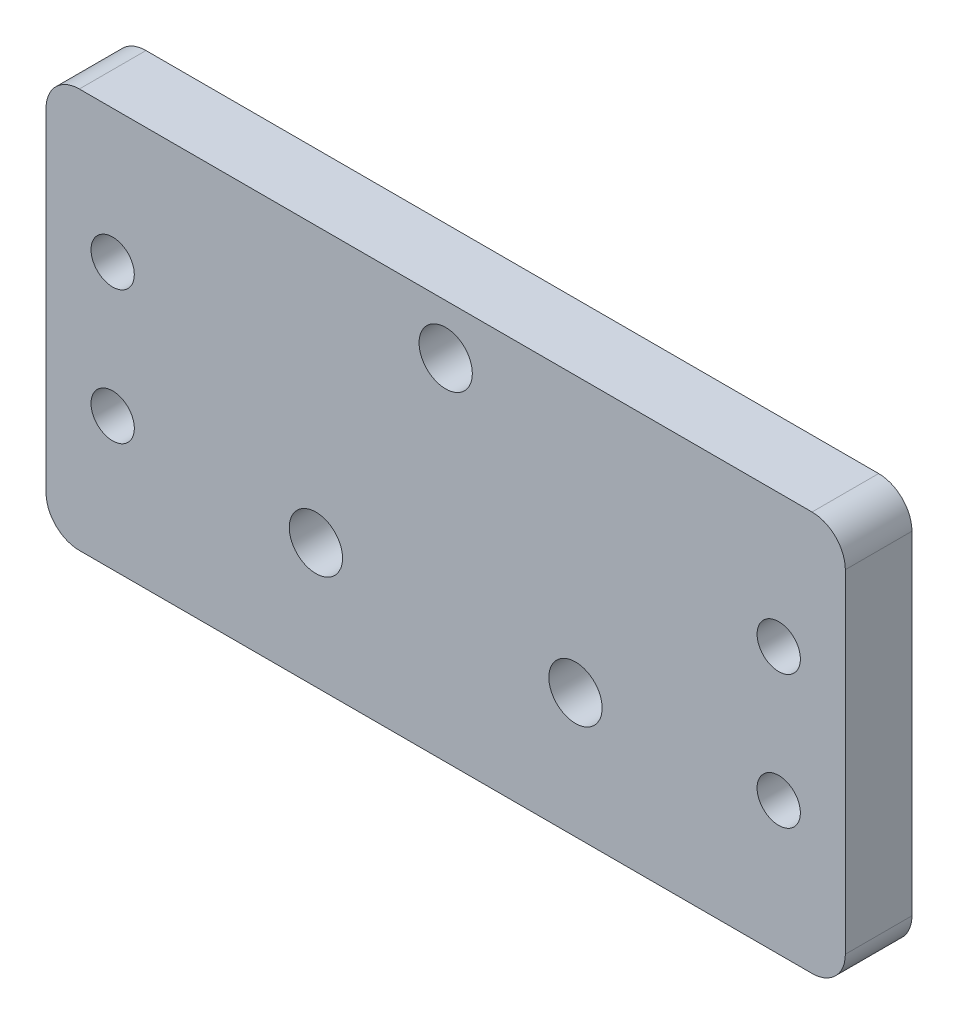
ISO-10303-21;
HEADER;
FILE_DESCRIPTION(('STEP AP214'),'2;1');
FILE_NAME('part.step','',(''),(''),'','','');
FILE_SCHEMA(('AUTOMOTIVE_DESIGN { 1 0 10303 214 1 1 1 1 }'));
ENDSEC;
DATA;
#1=APPLICATION_CONTEXT('core data for automotive mechanical design processes');
#2=APPLICATION_PROTOCOL_DEFINITION('international standard','automotive_design',2000,#1);
#3=PRODUCT_CONTEXT('',#1,'mechanical');
#4=PRODUCT('Part','Part','',(#3));
#5=PRODUCT_RELATED_PRODUCT_CATEGORY('part','',(#4));
#6=PRODUCT_DEFINITION_FORMATION('','',#4);
#7=PRODUCT_DEFINITION_CONTEXT('part definition',#1,'design');
#8=PRODUCT_DEFINITION('design','',#6,#7);
#9=PRODUCT_DEFINITION_SHAPE('','',#8);
#10=(LENGTH_UNIT() NAMED_UNIT(*) SI_UNIT(.MILLI.,.METRE.));
#11=(NAMED_UNIT(*) PLANE_ANGLE_UNIT() SI_UNIT($,.RADIAN.));
#12=(NAMED_UNIT(*) SI_UNIT($,.STERADIAN.) SOLID_ANGLE_UNIT());
#13=UNCERTAINTY_MEASURE_WITH_UNIT(LENGTH_MEASURE(1.E-05),#10,'distance_accuracy_value','');
#14=(GEOMETRIC_REPRESENTATION_CONTEXT(3) GLOBAL_UNCERTAINTY_ASSIGNED_CONTEXT((#13)) GLOBAL_UNIT_ASSIGNED_CONTEXT((#10,
#11,#12)) REPRESENTATION_CONTEXT('',''));
#15=CARTESIAN_POINT('',(0.,0.,0.));
#16=DIRECTION('',(0.,0.,1.));
#17=DIRECTION('',(1.,0.,0.));
#18=AXIS2_PLACEMENT_3D('',#15,#16,#17);
#19=CARTESIAN_POINT('',(40.5144284148502,18.7499999999999,0.));
#20=DIRECTION('',(0.,0.,1.));
#21=DIRECTION('',(1.,0.,0.));
#22=AXIS2_PLACEMENT_3D('',#19,#20,#21);
#23=CYLINDRICAL_SURFACE('',#22,2.25);
#24=CARTESIAN_POINT('',(40.5144284148502,18.7499999999999,0.));
#25=DIRECTION('',(0.,0.,1.));
#26=DIRECTION('',(-1.,0.,0.));
#27=AXIS2_PLACEMENT_3D('',#24,#25,#26);
#28=CIRCLE('',#27,2.25);
#29=CARTESIAN_POINT('',(38.2644284148502,18.7499999999999,0.));
#30=VERTEX_POINT('',#29);
#31=EDGE_CURVE('E163',#30,#30,#28,.T.);
#32=ORIENTED_EDGE('',*,*,#31,.F.);
#33=EDGE_LOOP('',(#32));
#34=FACE_BOUND('',#33,.T.);
#35=CARTESIAN_POINT('',(40.5144284148502,18.7499999999999,4.));
#36=DIRECTION('',(0.,0.,1.));
#37=DIRECTION('',(1.,0.,0.));
#38=AXIS2_PLACEMENT_3D('',#35,#36,#37);
#39=CIRCLE('',#38,2.25);
#40=CARTESIAN_POINT('',(42.7644284148502,18.7499999999999,4.));
#41=VERTEX_POINT('',#40);
#42=EDGE_CURVE('E159',#41,#41,#39,.F.);
#43=ORIENTED_EDGE('',*,*,#42,.F.);
#44=EDGE_LOOP('',(#43));
#45=FACE_BOUND('',#44,.T.);
#46=ADVANCED_FACE('F43',(#34,#45),#23,.F.);
#47=CARTESIAN_POINT('',(79.4855715851498,18.7499999999999,0.));
#48=DIRECTION('',(0.,0.,1.));
#49=DIRECTION('',(1.,0.,0.));
#50=AXIS2_PLACEMENT_3D('',#47,#48,#49);
#51=CYLINDRICAL_SURFACE('',#50,2.24999999999999);
#52=CARTESIAN_POINT('',(79.4855715851498,18.7499999999999,0.));
#53=DIRECTION('',(0.,0.,1.));
#54=DIRECTION('',(1.,0.,0.));
#55=AXIS2_PLACEMENT_3D('',#52,#53,#54);
#56=CIRCLE('',#55,2.24999999999999);
#57=CARTESIAN_POINT('',(81.7355715851498,18.7499999999999,0.));
#58=VERTEX_POINT('',#57);
#59=EDGE_CURVE('E254',#58,#58,#56,.T.);
#60=ORIENTED_EDGE('',*,*,#59,.F.);
#61=EDGE_LOOP('',(#60));
#62=FACE_BOUND('',#61,.T.);
#63=CARTESIAN_POINT('',(79.4855715851498,18.7499999999999,4.));
#64=DIRECTION('',(0.,0.,1.));
#65=DIRECTION('',(1.,0.,0.));
#66=AXIS2_PLACEMENT_3D('',#63,#64,#65);
#67=CIRCLE('',#66,2.24999999999999);
#68=CARTESIAN_POINT('',(81.7355715851498,18.7499999999999,4.));
#69=VERTEX_POINT('',#68);
#70=EDGE_CURVE('E154',#69,#69,#67,.F.);
#71=ORIENTED_EDGE('',*,*,#70,.F.);
#72=EDGE_LOOP('',(#71));
#73=FACE_BOUND('',#72,.T.);
#74=ADVANCED_FACE('F326',(#62,#73),#51,.F.);
#75=CARTESIAN_POINT('',(60.,52.5,0.));
#76=DIRECTION('',(0.,0.,1.));
#77=DIRECTION('',(1.,0.,0.));
#78=AXIS2_PLACEMENT_3D('',#75,#76,#77);
#79=CYLINDRICAL_SURFACE('',#78,2.25);
#80=CARTESIAN_POINT('',(60.,52.5,0.));
#81=DIRECTION('',(0.,0.,1.));
#82=DIRECTION('',(1.,0.,0.));
#83=AXIS2_PLACEMENT_3D('',#80,#81,#82);
#84=CIRCLE('',#83,2.25);
#85=CARTESIAN_POINT('',(62.25,52.5,0.));
#86=VERTEX_POINT('',#85);
#87=EDGE_CURVE('E232',#86,#86,#84,.T.);
#88=ORIENTED_EDGE('',*,*,#87,.F.);
#89=EDGE_LOOP('',(#88));
#90=FACE_BOUND('',#89,.T.);
#91=CARTESIAN_POINT('',(60.,52.5,4.));
#92=DIRECTION('',(0.,0.,1.));
#93=DIRECTION('',(1.,0.,0.));
#94=AXIS2_PLACEMENT_3D('',#91,#92,#93);
#95=CIRCLE('',#94,2.25);
#96=CARTESIAN_POINT('',(62.25,52.5,4.));
#97=VERTEX_POINT('',#96);
#98=EDGE_CURVE('E150',#97,#97,#95,.F.);
#99=ORIENTED_EDGE('',*,*,#98,.F.);
#100=EDGE_LOOP('',(#99));
#101=FACE_BOUND('',#100,.T.);
#102=ADVANCED_FACE('F332',(#90,#101),#79,.F.);
#103=CARTESIAN_POINT('',(0.,0.,10.));
#104=DIRECTION('',(1.,0.,0.));
#105=DIRECTION('',(0.,0.,-1.));
#106=AXIS2_PLACEMENT_3D('',#103,#104,#105);
#107=PLANE('',#106);
#108=DIRECTION('',(0.,-1.,0.));
#109=VECTOR('',#108,1.);
#110=CARTESIAN_POINT('',(0.,0.,0.));
#111=LINE('',#110,#109);
#112=CARTESIAN_POINT('',(0.,55.,0.));
#113=VERTEX_POINT('',#112);
#114=CARTESIAN_POINT('',(0.,5.,0.));
#115=VERTEX_POINT('',#114);
#116=EDGE_CURVE('E201',#113,#115,#111,.T.);
#117=ORIENTED_EDGE('',*,*,#116,.T.);
#118=DIRECTION('',(0.,0.,-1.));
#119=VECTOR('',#118,1.);
#120=CARTESIAN_POINT('',(0.,5.,10.));
#121=LINE('',#120,#119);
#122=CARTESIAN_POINT('',(0.,5.,10.));
#123=VERTEX_POINT('',#122);
#124=EDGE_CURVE('E11',#115,#123,#121,.F.);
#125=ORIENTED_EDGE('',*,*,#124,.T.);
#126=DIRECTION('',(0.,-1.,0.));
#127=VECTOR('',#126,1.);
#128=CARTESIAN_POINT('',(0.,0.,10.));
#129=LINE('',#128,#127);
#130=CARTESIAN_POINT('',(0.,55.,10.));
#131=VERTEX_POINT('',#130);
#132=EDGE_CURVE('E139',#131,#123,#129,.T.);
#133=ORIENTED_EDGE('',*,*,#132,.F.);
#134=DIRECTION('',(0.,0.,-1.));
#135=VECTOR('',#134,1.);
#136=CARTESIAN_POINT('',(0.,55.,10.));
#137=LINE('',#136,#135);
#138=EDGE_CURVE('E52',#131,#113,#137,.T.);
#139=ORIENTED_EDGE('',*,*,#138,.T.);
#140=EDGE_LOOP('',(#117,#125,#133,#139));
#141=FACE_BOUND('',#140,.T.);
#142=ADVANCED_FACE('F200',(#141),#107,.F.);
#143=CARTESIAN_POINT('',(0.,0.,10.));
#144=DIRECTION('',(0.,1.,0.));
#145=DIRECTION('',(0.,0.,1.));
#146=AXIS2_PLACEMENT_3D('',#143,#144,#145);
#147=PLANE('',#146);
#148=DIRECTION('',(1.,0.,0.));
#149=VECTOR('',#148,1.);
#150=CARTESIAN_POINT('',(0.,0.,0.));
#151=LINE('',#150,#149);
#152=CARTESIAN_POINT('',(5.,0.,0.));
#153=VERTEX_POINT('',#152);
#154=CARTESIAN_POINT('',(115.,0.,0.));
#155=VERTEX_POINT('',#154);
#156=EDGE_CURVE('E146',#153,#155,#151,.T.);
#157=ORIENTED_EDGE('',*,*,#156,.T.);
#158=DIRECTION('',(0.,0.,-1.));
#159=VECTOR('',#158,1.);
#160=CARTESIAN_POINT('',(115.,0.,10.));
#161=LINE('',#160,#159);
#162=CARTESIAN_POINT('',(115.,0.,10.));
#163=VERTEX_POINT('',#162);
#164=EDGE_CURVE('E59',#155,#163,#161,.F.);
#165=ORIENTED_EDGE('',*,*,#164,.T.);
#166=DIRECTION('',(1.,0.,0.));
#167=VECTOR('',#166,1.);
#168=CARTESIAN_POINT('',(0.,0.,10.));
#169=LINE('',#168,#167);
#170=CARTESIAN_POINT('',(5.,0.,10.));
#171=VERTEX_POINT('',#170);
#172=EDGE_CURVE('E144',#171,#163,#169,.T.);
#173=ORIENTED_EDGE('',*,*,#172,.F.);
#174=DIRECTION('',(0.,0.,-1.));
#175=VECTOR('',#174,1.);
#176=CARTESIAN_POINT('',(5.,0.,10.));
#177=LINE('',#176,#175);
#178=EDGE_CURVE('E189',#171,#153,#177,.T.);
#179=ORIENTED_EDGE('',*,*,#178,.T.);
#180=EDGE_LOOP('',(#157,#165,#173,#179));
#181=FACE_BOUND('',#180,.T.);
#182=ADVANCED_FACE('F317',(#181),#147,.F.);
#183=CARTESIAN_POINT('',(120.,0.,10.));
#184=DIRECTION('',(-1.,0.,0.));
#185=DIRECTION('',(0.,0.,1.));
#186=AXIS2_PLACEMENT_3D('',#183,#184,#185);
#187=PLANE('',#186);
#188=DIRECTION('',(0.,1.,0.));
#189=VECTOR('',#188,1.);
#190=CARTESIAN_POINT('',(120.,0.,0.));
#191=LINE('',#190,#189);
#192=CARTESIAN_POINT('',(120.,5.,0.));
#193=VERTEX_POINT('',#192);
#194=CARTESIAN_POINT('',(120.,55.,0.));
#195=VERTEX_POINT('',#194);
#196=EDGE_CURVE('E140',#193,#195,#191,.T.);
#197=ORIENTED_EDGE('',*,*,#196,.T.);
#198=DIRECTION('',(0.,0.,-1.));
#199=VECTOR('',#198,1.);
#200=CARTESIAN_POINT('',(120.,55.,10.));
#201=LINE('',#200,#199);
#202=CARTESIAN_POINT('',(120.,55.,10.));
#203=VERTEX_POINT('',#202);
#204=EDGE_CURVE('E115',#195,#203,#201,.F.);
#205=ORIENTED_EDGE('',*,*,#204,.T.);
#206=DIRECTION('',(0.,1.,0.));
#207=VECTOR('',#206,1.);
#208=CARTESIAN_POINT('',(120.,0.,10.));
#209=LINE('',#208,#207);
#210=CARTESIAN_POINT('',(120.,5.,10.));
#211=VERTEX_POINT('',#210);
#212=EDGE_CURVE('E217',#211,#203,#209,.T.);
#213=ORIENTED_EDGE('',*,*,#212,.F.);
#214=DIRECTION('',(0.,0.,-1.));
#215=VECTOR('',#214,1.);
#216=CARTESIAN_POINT('',(120.,5.,10.));
#217=LINE('',#216,#215);
#218=EDGE_CURVE('E121',#211,#193,#217,.T.);
#219=ORIENTED_EDGE('',*,*,#218,.T.);
#220=EDGE_LOOP('',(#197,#205,#213,#219));
#221=FACE_BOUND('',#220,.T.);
#222=ADVANCED_FACE('F314',(#221),#187,.F.);
#223=CARTESIAN_POINT('',(0.,60.,10.));
#224=DIRECTION('',(0.,-1.,0.));
#225=DIRECTION('',(0.,0.,-1.));
#226=AXIS2_PLACEMENT_3D('',#223,#224,#225);
#227=PLANE('',#226);
#228=DIRECTION('',(-1.,0.,0.));
#229=VECTOR('',#228,1.);
#230=CARTESIAN_POINT('',(0.,60.,10.));
#231=LINE('',#230,#229);
#232=CARTESIAN_POINT('',(115.,60.,10.));
#233=VERTEX_POINT('',#232);
#234=CARTESIAN_POINT('',(5.,60.,10.));
#235=VERTEX_POINT('',#234);
#236=EDGE_CURVE('E131',#233,#235,#231,.T.);
#237=ORIENTED_EDGE('',*,*,#236,.F.);
#238=DIRECTION('',(0.,0.,-1.));
#239=VECTOR('',#238,1.);
#240=CARTESIAN_POINT('',(115.,60.,10.));
#241=LINE('',#240,#239);
#242=CARTESIAN_POINT('',(115.,60.,0.));
#243=VERTEX_POINT('',#242);
#244=EDGE_CURVE('E114',#233,#243,#241,.T.);
#245=ORIENTED_EDGE('',*,*,#244,.T.);
#246=DIRECTION('',(-1.,0.,0.));
#247=VECTOR('',#246,1.);
#248=CARTESIAN_POINT('',(0.,60.,0.));
#249=LINE('',#248,#247);
#250=CARTESIAN_POINT('',(5.,60.,0.));
#251=VERTEX_POINT('',#250);
#252=EDGE_CURVE('E128',#243,#251,#249,.T.);
#253=ORIENTED_EDGE('',*,*,#252,.T.);
#254=DIRECTION('',(0.,0.,-1.));
#255=VECTOR('',#254,1.);
#256=CARTESIAN_POINT('',(5.,60.,10.));
#257=LINE('',#256,#255);
#258=EDGE_CURVE('E134',#251,#235,#257,.F.);
#259=ORIENTED_EDGE('',*,*,#258,.T.);
#260=EDGE_LOOP('',(#237,#245,#253,#259));
#261=FACE_BOUND('',#260,.T.);
#262=ADVANCED_FACE('F127',(#261),#227,.F.);
#263=CARTESIAN_POINT('',(0.,0.,10.));
#264=DIRECTION('',(0.,0.,-1.));
#265=DIRECTION('',(-1.,0.,0.));
#266=AXIS2_PLACEMENT_3D('',#263,#264,#265);
#267=PLANE('',#266);
#268=CARTESIAN_POINT('',(60.,52.5,10.));
#269=DIRECTION('',(0.,0.,1.));
#270=DIRECTION('',(1.,0.,0.));
#271=AXIS2_PLACEMENT_3D('',#268,#269,#270);
#272=CIRCLE('',#271,4.00000000000001);
#273=CARTESIAN_POINT('',(64.,52.5,10.));
#274=VERTEX_POINT('',#273);
#275=EDGE_CURVE('E277',#274,#274,#272,.T.);
#276=ORIENTED_EDGE('',*,*,#275,.F.);
#277=EDGE_LOOP('',(#276));
#278=FACE_BOUND('',#277,.T.);
#279=CARTESIAN_POINT('',(79.4855715851498,18.7499999999999,10.));
#280=DIRECTION('',(0.,0.,1.));
#281=DIRECTION('',(1.,0.,0.));
#282=AXIS2_PLACEMENT_3D('',#279,#280,#281);
#283=CIRCLE('',#282,4.00000000000001);
#284=CARTESIAN_POINT('',(83.4855715851498,18.7499999999999,10.));
#285=VERTEX_POINT('',#284);
#286=EDGE_CURVE('E273',#285,#285,#283,.T.);
#287=ORIENTED_EDGE('',*,*,#286,.F.);
#288=EDGE_LOOP('',(#287));
#289=FACE_BOUND('',#288,.T.);
#290=CARTESIAN_POINT('',(40.5144284148502,18.7499999999999,10.));
#291=DIRECTION('',(0.,0.,1.));
#292=DIRECTION('',(1.,0.,0.));
#293=AXIS2_PLACEMENT_3D('',#290,#291,#292);
#294=CIRCLE('',#293,4.00000000000001);
#295=CARTESIAN_POINT('',(44.5144284148502,18.7499999999999,10.));
#296=VERTEX_POINT('',#295);
#297=EDGE_CURVE('E265',#296,#296,#294,.T.);
#298=ORIENTED_EDGE('',*,*,#297,.F.);
#299=EDGE_LOOP('',(#298));
#300=FACE_BOUND('',#299,.T.);
#301=CARTESIAN_POINT('',(10.,20.,10.));
#302=DIRECTION('',(0.,0.,1.));
#303=DIRECTION('',(-1.,0.,0.));
#304=AXIS2_PLACEMENT_3D('',#301,#302,#303);
#305=CIRCLE('',#304,3.25);
#306=CARTESIAN_POINT('',(6.75,20.,10.));
#307=VERTEX_POINT('',#306);
#308=EDGE_CURVE('E231',#307,#307,#305,.T.);
#309=ORIENTED_EDGE('',*,*,#308,.F.);
#310=EDGE_LOOP('',(#309));
#311=FACE_BOUND('',#310,.T.);
#312=CARTESIAN_POINT('',(110.,20.,10.));
#313=DIRECTION('',(0.,0.,1.));
#314=DIRECTION('',(-1.,0.,0.));
#315=AXIS2_PLACEMENT_3D('',#312,#313,#314);
#316=CIRCLE('',#315,3.25000000000001);
#317=CARTESIAN_POINT('',(106.75,20.,10.));
#318=VERTEX_POINT('',#317);
#319=EDGE_CURVE('E240',#318,#318,#316,.T.);
#320=ORIENTED_EDGE('',*,*,#319,.F.);
#321=EDGE_LOOP('',(#320));
#322=FACE_BOUND('',#321,.T.);
#323=CARTESIAN_POINT('',(110.,40.,10.));
#324=DIRECTION('',(0.,0.,1.));
#325=DIRECTION('',(1.,0.,0.));
#326=AXIS2_PLACEMENT_3D('',#323,#324,#325);
#327=CIRCLE('',#326,3.25000000000001);
#328=CARTESIAN_POINT('',(113.25,40.,10.));
#329=VERTEX_POINT('',#328);
#330=EDGE_CURVE('E225',#329,#329,#327,.T.);
#331=ORIENTED_EDGE('',*,*,#330,.F.);
#332=EDGE_LOOP('',(#331));
#333=FACE_BOUND('',#332,.T.);
#334=CARTESIAN_POINT('',(10.,40.,10.));
#335=DIRECTION('',(0.,0.,1.));
#336=DIRECTION('',(1.,0.,0.));
#337=AXIS2_PLACEMENT_3D('',#334,#335,#336);
#338=CIRCLE('',#337,3.25);
#339=CARTESIAN_POINT('',(13.25,40.,10.));
#340=VERTEX_POINT('',#339);
#341=EDGE_CURVE('E212',#340,#340,#338,.T.);
#342=ORIENTED_EDGE('',*,*,#341,.F.);
#343=EDGE_LOOP('',(#342));
#344=FACE_BOUND('',#343,.T.);
#345=ORIENTED_EDGE('',*,*,#212,.T.);
#346=CARTESIAN_POINT('',(115.,55.,10.));
#347=DIRECTION('',(0.,0.,-1.));
#348=DIRECTION('',(-1.,0.,0.));
#349=AXIS2_PLACEMENT_3D('',#346,#347,#348);
#350=CIRCLE('',#349,5.);
#351=EDGE_CURVE('E186',#203,#233,#350,.F.);
#352=ORIENTED_EDGE('',*,*,#351,.T.);
#353=ORIENTED_EDGE('',*,*,#236,.T.);
#354=CARTESIAN_POINT('',(5.,55.,10.));
#355=DIRECTION('',(0.,0.,-1.));
#356=DIRECTION('',(-1.,0.,0.));
#357=AXIS2_PLACEMENT_3D('',#354,#355,#356);
#358=CIRCLE('',#357,5.);
#359=EDGE_CURVE('E178',#235,#131,#358,.F.);
#360=ORIENTED_EDGE('',*,*,#359,.T.);
#361=ORIENTED_EDGE('',*,*,#132,.T.);
#362=CARTESIAN_POINT('',(5.,5.,10.));
#363=DIRECTION('',(0.,0.,-1.));
#364=DIRECTION('',(-1.,0.,0.));
#365=AXIS2_PLACEMENT_3D('',#362,#363,#364);
#366=CIRCLE('',#365,5.);
#367=EDGE_CURVE('E66',#123,#171,#366,.F.);
#368=ORIENTED_EDGE('',*,*,#367,.T.);
#369=ORIENTED_EDGE('',*,*,#172,.T.);
#370=CARTESIAN_POINT('',(115.,5.,10.));
#371=DIRECTION('',(0.,0.,-1.));
#372=DIRECTION('',(-1.,0.,0.));
#373=AXIS2_PLACEMENT_3D('',#370,#371,#372);
#374=CIRCLE('',#373,5.);
#375=EDGE_CURVE('E183',#163,#211,#374,.F.);
#376=ORIENTED_EDGE('',*,*,#375,.T.);
#377=EDGE_LOOP('',(#345,#352,#353,#360,#361,#368,#369,#376));
#378=FACE_BOUND('',#377,.T.);
#379=ADVANCED_FACE('F295',(#278,#289,#300,#311,#322,#333,#344,#378),#267,.F.);
#380=CARTESIAN_POINT('',(0.,0.,0.));
#381=DIRECTION('',(0.,0.,-1.));
#382=DIRECTION('',(-1.,0.,0.));
#383=AXIS2_PLACEMENT_3D('',#380,#381,#382);
#384=PLANE('',#383);
#385=ORIENTED_EDGE('',*,*,#87,.T.);
#386=EDGE_LOOP('',(#385));
#387=FACE_BOUND('',#386,.T.);
#388=ORIENTED_EDGE('',*,*,#59,.T.);
#389=EDGE_LOOP('',(#388));
#390=FACE_BOUND('',#389,.T.);
#391=ORIENTED_EDGE('',*,*,#31,.T.);
#392=EDGE_LOOP('',(#391));
#393=FACE_BOUND('',#392,.T.);
#394=CARTESIAN_POINT('',(10.,20.,0.));
#395=DIRECTION('',(0.,0.,1.));
#396=DIRECTION('',(-1.,0.,0.));
#397=AXIS2_PLACEMENT_3D('',#394,#395,#396);
#398=CIRCLE('',#397,3.25);
#399=CARTESIAN_POINT('',(6.75,20.,0.));
#400=VERTEX_POINT('',#399);
#401=EDGE_CURVE('E227',#400,#400,#398,.T.);
#402=ORIENTED_EDGE('',*,*,#401,.T.);
#403=EDGE_LOOP('',(#402));
#404=FACE_BOUND('',#403,.T.);
#405=CARTESIAN_POINT('',(110.,20.,0.));
#406=DIRECTION('',(0.,0.,1.));
#407=DIRECTION('',(-1.,0.,0.));
#408=AXIS2_PLACEMENT_3D('',#405,#406,#407);
#409=CIRCLE('',#408,3.25000000000001);
#410=CARTESIAN_POINT('',(106.75,20.,0.));
#411=VERTEX_POINT('',#410);
#412=EDGE_CURVE('E236',#411,#411,#409,.T.);
#413=ORIENTED_EDGE('',*,*,#412,.T.);
#414=EDGE_LOOP('',(#413));
#415=FACE_BOUND('',#414,.T.);
#416=CARTESIAN_POINT('',(110.,40.,0.));
#417=DIRECTION('',(0.,0.,1.));
#418=DIRECTION('',(1.,0.,0.));
#419=AXIS2_PLACEMENT_3D('',#416,#417,#418);
#420=CIRCLE('',#419,3.25000000000001);
#421=CARTESIAN_POINT('',(113.25,40.,0.));
#422=VERTEX_POINT('',#421);
#423=EDGE_CURVE('E244',#422,#422,#420,.T.);
#424=ORIENTED_EDGE('',*,*,#423,.T.);
#425=EDGE_LOOP('',(#424));
#426=FACE_BOUND('',#425,.T.);
#427=CARTESIAN_POINT('',(10.,40.,0.));
#428=DIRECTION('',(0.,0.,1.));
#429=DIRECTION('',(1.,0.,0.));
#430=AXIS2_PLACEMENT_3D('',#427,#428,#429);
#431=CIRCLE('',#430,3.25);
#432=CARTESIAN_POINT('',(13.25,40.,0.));
#433=VERTEX_POINT('',#432);
#434=EDGE_CURVE('E207',#433,#433,#431,.T.);
#435=ORIENTED_EDGE('',*,*,#434,.T.);
#436=EDGE_LOOP('',(#435));
#437=FACE_BOUND('',#436,.T.);
#438=ORIENTED_EDGE('',*,*,#252,.F.);
#439=CARTESIAN_POINT('',(115.,55.,0.));
#440=DIRECTION('',(0.,0.,-1.));
#441=DIRECTION('',(-1.,0.,0.));
#442=AXIS2_PLACEMENT_3D('',#439,#440,#441);
#443=CIRCLE('',#442,5.);
#444=EDGE_CURVE('E110',#243,#195,#443,.T.);
#445=ORIENTED_EDGE('',*,*,#444,.T.);
#446=ORIENTED_EDGE('',*,*,#196,.F.);
#447=CARTESIAN_POINT('',(115.,5.,0.));
#448=DIRECTION('',(0.,0.,-1.));
#449=DIRECTION('',(-1.,0.,0.));
#450=AXIS2_PLACEMENT_3D('',#447,#448,#449);
#451=CIRCLE('',#450,5.);
#452=EDGE_CURVE('E122',#193,#155,#451,.T.);
#453=ORIENTED_EDGE('',*,*,#452,.T.);
#454=ORIENTED_EDGE('',*,*,#156,.F.);
#455=CARTESIAN_POINT('',(5.,5.,0.));
#456=DIRECTION('',(0.,0.,-1.));
#457=DIRECTION('',(-1.,0.,0.));
#458=AXIS2_PLACEMENT_3D('',#455,#456,#457);
#459=CIRCLE('',#458,5.);
#460=EDGE_CURVE('E168',#153,#115,#459,.T.);
#461=ORIENTED_EDGE('',*,*,#460,.T.);
#462=ORIENTED_EDGE('',*,*,#116,.F.);
#463=CARTESIAN_POINT('',(5.,55.,0.));
#464=DIRECTION('',(0.,0.,-1.));
#465=DIRECTION('',(-1.,0.,0.));
#466=AXIS2_PLACEMENT_3D('',#463,#464,#465);
#467=CIRCLE('',#466,5.);
#468=EDGE_CURVE('E133',#113,#251,#467,.T.);
#469=ORIENTED_EDGE('',*,*,#468,.T.);
#470=EDGE_LOOP('',(#438,#445,#446,#453,#454,#461,#462,#469));
#471=FACE_BOUND('',#470,.T.);
#472=ADVANCED_FACE('F136',(#387,#390,#393,#404,#415,#426,#437,#471),#384,.T.);
#473=CARTESIAN_POINT('',(10.,40.,0.));
#474=DIRECTION('',(0.,0.,1.));
#475=DIRECTION('',(1.,0.,0.));
#476=AXIS2_PLACEMENT_3D('',#473,#474,#475);
#477=CYLINDRICAL_SURFACE('',#476,3.25);
#478=ORIENTED_EDGE('',*,*,#434,.F.);
#479=EDGE_LOOP('',(#478));
#480=FACE_BOUND('',#479,.T.);
#481=ORIENTED_EDGE('',*,*,#341,.T.);
#482=EDGE_LOOP('',(#481));
#483=FACE_BOUND('',#482,.T.);
#484=ADVANCED_FACE('F343',(#480,#483),#477,.F.);
#485=CARTESIAN_POINT('',(110.,40.,0.));
#486=DIRECTION('',(0.,0.,1.));
#487=DIRECTION('',(1.,0.,0.));
#488=AXIS2_PLACEMENT_3D('',#485,#486,#487);
#489=CYLINDRICAL_SURFACE('',#488,3.25000000000001);
#490=ORIENTED_EDGE('',*,*,#423,.F.);
#491=EDGE_LOOP('',(#490));
#492=FACE_BOUND('',#491,.T.);
#493=ORIENTED_EDGE('',*,*,#330,.T.);
#494=EDGE_LOOP('',(#493));
#495=FACE_BOUND('',#494,.T.);
#496=ADVANCED_FACE('F339',(#492,#495),#489,.F.);
#497=CARTESIAN_POINT('',(110.,20.,0.));
#498=DIRECTION('',(0.,0.,1.));
#499=DIRECTION('',(1.,0.,0.));
#500=AXIS2_PLACEMENT_3D('',#497,#498,#499);
#501=CYLINDRICAL_SURFACE('',#500,3.25000000000001);
#502=ORIENTED_EDGE('',*,*,#412,.F.);
#503=EDGE_LOOP('',(#502));
#504=FACE_BOUND('',#503,.T.);
#505=ORIENTED_EDGE('',*,*,#319,.T.);
#506=EDGE_LOOP('',(#505));
#507=FACE_BOUND('',#506,.T.);
#508=ADVANCED_FACE('F342',(#504,#507),#501,.F.);
#509=CARTESIAN_POINT('',(10.,20.,0.));
#510=DIRECTION('',(0.,0.,1.));
#511=DIRECTION('',(1.,0.,0.));
#512=AXIS2_PLACEMENT_3D('',#509,#510,#511);
#513=CYLINDRICAL_SURFACE('',#512,3.25);
#514=ORIENTED_EDGE('',*,*,#401,.F.);
#515=EDGE_LOOP('',(#514));
#516=FACE_BOUND('',#515,.T.);
#517=ORIENTED_EDGE('',*,*,#308,.T.);
#518=EDGE_LOOP('',(#517));
#519=FACE_BOUND('',#518,.T.);
#520=ADVANCED_FACE('F347',(#516,#519),#513,.F.);
#521=CARTESIAN_POINT('',(60.,52.5,4.));
#522=DIRECTION('',(0.,0.,1.));
#523=DIRECTION('',(1.,0.,0.));
#524=AXIS2_PLACEMENT_3D('',#521,#522,#523);
#525=PLANE('',#524);
#526=CARTESIAN_POINT('',(60.,52.5,4.));
#527=DIRECTION('',(0.,0.,1.));
#528=DIRECTION('',(1.,0.,0.));
#529=AXIS2_PLACEMENT_3D('',#526,#527,#528);
#530=CIRCLE('',#529,4.00000000000001);
#531=CARTESIAN_POINT('',(64.,52.5,4.));
#532=VERTEX_POINT('',#531);
#533=EDGE_CURVE('E155',#532,#532,#530,.T.);
#534=ORIENTED_EDGE('',*,*,#533,.T.);
#535=EDGE_LOOP('',(#534));
#536=FACE_BOUND('',#535,.T.);
#537=ORIENTED_EDGE('',*,*,#98,.T.);
#538=EDGE_LOOP('',(#537));
#539=FACE_BOUND('',#538,.T.);
#540=ADVANCED_FACE('F285',(#536,#539),#525,.T.);
#541=CARTESIAN_POINT('',(60.,52.5,4.));
#542=DIRECTION('',(0.,0.,1.));
#543=DIRECTION('',(1.,0.,0.));
#544=AXIS2_PLACEMENT_3D('',#541,#542,#543);
#545=CYLINDRICAL_SURFACE('',#544,4.00000000000001);
#546=ORIENTED_EDGE('',*,*,#533,.F.);
#547=EDGE_LOOP('',(#546));
#548=FACE_BOUND('',#547,.T.);
#549=ORIENTED_EDGE('',*,*,#275,.T.);
#550=EDGE_LOOP('',(#549));
#551=FACE_BOUND('',#550,.T.);
#552=ADVANCED_FACE('F288',(#548,#551),#545,.F.);
#553=CARTESIAN_POINT('',(79.4855715851498,18.7499999999999,4.));
#554=DIRECTION('',(0.,0.,1.));
#555=DIRECTION('',(1.,0.,0.));
#556=AXIS2_PLACEMENT_3D('',#553,#554,#555);
#557=PLANE('',#556);
#558=CARTESIAN_POINT('',(79.4855715851498,18.7499999999999,4.));
#559=DIRECTION('',(0.,0.,1.));
#560=DIRECTION('',(1.,0.,0.));
#561=AXIS2_PLACEMENT_3D('',#558,#559,#560);
#562=CIRCLE('',#561,4.00000000000001);
#563=CARTESIAN_POINT('',(83.4855715851498,18.7499999999999,4.));
#564=VERTEX_POINT('',#563);
#565=EDGE_CURVE('E269',#564,#564,#562,.T.);
#566=ORIENTED_EDGE('',*,*,#565,.T.);
#567=EDGE_LOOP('',(#566));
#568=FACE_BOUND('',#567,.T.);
#569=ORIENTED_EDGE('',*,*,#70,.T.);
#570=EDGE_LOOP('',(#569));
#571=FACE_BOUND('',#570,.T.);
#572=ADVANCED_FACE('F291',(#568,#571),#557,.T.);
#573=CARTESIAN_POINT('',(79.4855715851498,18.7499999999999,4.));
#574=DIRECTION('',(0.,0.,1.));
#575=DIRECTION('',(1.,0.,0.));
#576=AXIS2_PLACEMENT_3D('',#573,#574,#575);
#577=CYLINDRICAL_SURFACE('',#576,4.00000000000001);
#578=ORIENTED_EDGE('',*,*,#565,.F.);
#579=EDGE_LOOP('',(#578));
#580=FACE_BOUND('',#579,.T.);
#581=ORIENTED_EDGE('',*,*,#286,.T.);
#582=EDGE_LOOP('',(#581));
#583=FACE_BOUND('',#582,.T.);
#584=ADVANCED_FACE('F414',(#580,#583),#577,.F.);
#585=CARTESIAN_POINT('',(40.5144284148502,18.7499999999999,4.));
#586=DIRECTION('',(0.,0.,1.));
#587=DIRECTION('',(1.,0.,0.));
#588=AXIS2_PLACEMENT_3D('',#585,#586,#587);
#589=PLANE('',#588);
#590=CARTESIAN_POINT('',(40.5144284148502,18.7499999999999,4.));
#591=DIRECTION('',(0.,0.,1.));
#592=DIRECTION('',(1.,0.,0.));
#593=AXIS2_PLACEMENT_3D('',#590,#591,#592);
#594=CIRCLE('',#593,4.00000000000001);
#595=CARTESIAN_POINT('',(44.5144284148502,18.7499999999999,4.));
#596=VERTEX_POINT('',#595);
#597=EDGE_CURVE('E261',#596,#596,#594,.T.);
#598=ORIENTED_EDGE('',*,*,#597,.T.);
#599=EDGE_LOOP('',(#598));
#600=FACE_BOUND('',#599,.T.);
#601=ORIENTED_EDGE('',*,*,#42,.T.);
#602=EDGE_LOOP('',(#601));
#603=FACE_BOUND('',#602,.T.);
#604=ADVANCED_FACE('F404',(#600,#603),#589,.T.);
#605=CARTESIAN_POINT('',(40.5144284148502,18.7499999999999,4.));
#606=DIRECTION('',(0.,0.,1.));
#607=DIRECTION('',(1.,0.,0.));
#608=AXIS2_PLACEMENT_3D('',#605,#606,#607);
#609=CYLINDRICAL_SURFACE('',#608,4.00000000000001);
#610=ORIENTED_EDGE('',*,*,#597,.F.);
#611=EDGE_LOOP('',(#610));
#612=FACE_BOUND('',#611,.T.);
#613=ORIENTED_EDGE('',*,*,#297,.T.);
#614=EDGE_LOOP('',(#613));
#615=FACE_BOUND('',#614,.T.);
#616=ADVANCED_FACE('F368',(#612,#615),#609,.F.);
#617=CARTESIAN_POINT('',(115.,55.,10.));
#618=DIRECTION('',(0.,0.,-1.));
#619=DIRECTION('',(-1.,0.,0.));
#620=AXIS2_PLACEMENT_3D('',#617,#618,#619);
#621=CYLINDRICAL_SURFACE('',#620,5.);
#622=ORIENTED_EDGE('',*,*,#351,.F.);
#623=ORIENTED_EDGE('',*,*,#204,.F.);
#624=ORIENTED_EDGE('',*,*,#444,.F.);
#625=ORIENTED_EDGE('',*,*,#244,.F.);
#626=EDGE_LOOP('',(#622,#623,#624,#625));
#627=FACE_BOUND('',#626,.T.);
#628=ADVANCED_FACE('F113',(#627),#621,.T.);
#629=CARTESIAN_POINT('',(115.,5.,10.));
#630=DIRECTION('',(0.,0.,-1.));
#631=DIRECTION('',(-1.,0.,0.));
#632=AXIS2_PLACEMENT_3D('',#629,#630,#631);
#633=CYLINDRICAL_SURFACE('',#632,5.);
#634=ORIENTED_EDGE('',*,*,#375,.F.);
#635=ORIENTED_EDGE('',*,*,#164,.F.);
#636=ORIENTED_EDGE('',*,*,#452,.F.);
#637=ORIENTED_EDGE('',*,*,#218,.F.);
#638=EDGE_LOOP('',(#634,#635,#636,#637));
#639=FACE_BOUND('',#638,.T.);
#640=ADVANCED_FACE('F316',(#639),#633,.T.);
#641=CARTESIAN_POINT('',(5.,5.,10.));
#642=DIRECTION('',(0.,0.,-1.));
#643=DIRECTION('',(-1.,0.,0.));
#644=AXIS2_PLACEMENT_3D('',#641,#642,#643);
#645=CYLINDRICAL_SURFACE('',#644,5.);
#646=ORIENTED_EDGE('',*,*,#367,.F.);
#647=ORIENTED_EDGE('',*,*,#124,.F.);
#648=ORIENTED_EDGE('',*,*,#460,.F.);
#649=ORIENTED_EDGE('',*,*,#178,.F.);
#650=EDGE_LOOP('',(#646,#647,#648,#649));
#651=FACE_BOUND('',#650,.T.);
#652=ADVANCED_FACE('F320',(#651),#645,.T.);
#653=CARTESIAN_POINT('',(5.,55.,10.));
#654=DIRECTION('',(0.,0.,-1.));
#655=DIRECTION('',(-1.,0.,0.));
#656=AXIS2_PLACEMENT_3D('',#653,#654,#655);
#657=CYLINDRICAL_SURFACE('',#656,5.);
#658=ORIENTED_EDGE('',*,*,#359,.F.);
#659=ORIENTED_EDGE('',*,*,#258,.F.);
#660=ORIENTED_EDGE('',*,*,#468,.F.);
#661=ORIENTED_EDGE('',*,*,#138,.F.);
#662=EDGE_LOOP('',(#658,#659,#660,#661));
#663=FACE_BOUND('',#662,.T.);
#664=ADVANCED_FACE('F45',(#663),#657,.T.);
#665=CLOSED_SHELL('',(#46,#74,#102,#142,#182,#222,#262,#379,#472,#484,#496,#508,#520,#540,#552,
#572,#584,#604,#616,#628,#640,#652,#664));
#666=MANIFOLD_SOLID_BREP('B2',#665);
#667=ADVANCED_BREP_SHAPE_REPRESENTATION('',(#18,#666),#14);
#668=SHAPE_DEFINITION_REPRESENTATION(#9,#667);
ENDSEC;
END-ISO-10303-21;
